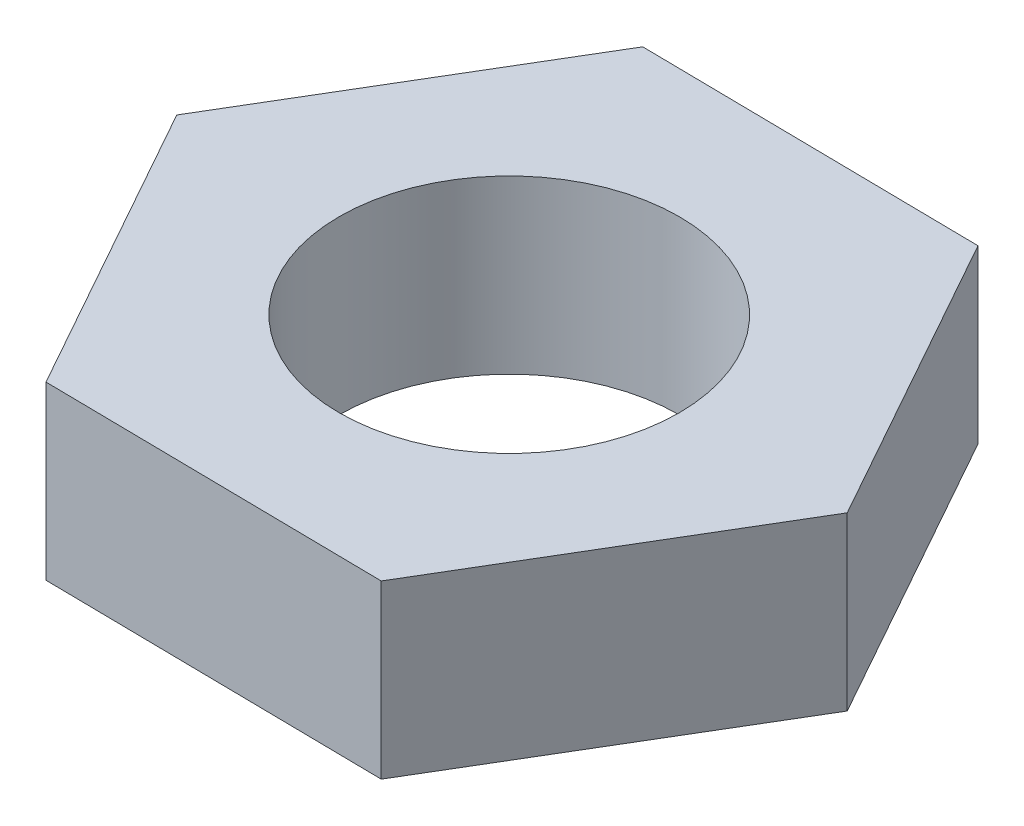
ISO-10303-21;
HEADER;
FILE_DESCRIPTION(('STEP AP214'),'2;1');
FILE_NAME('part.step','',(''),(''),'','','');
FILE_SCHEMA(('AUTOMOTIVE_DESIGN { 1 0 10303 214 1 1 1 1 }'));
ENDSEC;
DATA;
#1=APPLICATION_CONTEXT('core data for automotive mechanical design processes');
#2=APPLICATION_PROTOCOL_DEFINITION('international standard','automotive_design',2000,#1);
#3=PRODUCT_CONTEXT('',#1,'mechanical');
#4=PRODUCT('Part','Part','',(#3));
#5=PRODUCT_RELATED_PRODUCT_CATEGORY('part','',(#4));
#6=PRODUCT_DEFINITION_FORMATION('','',#4);
#7=PRODUCT_DEFINITION_CONTEXT('part definition',#1,'design');
#8=PRODUCT_DEFINITION('design','',#6,#7);
#9=PRODUCT_DEFINITION_SHAPE('','',#8);
#10=(LENGTH_UNIT() NAMED_UNIT(*) SI_UNIT(.MILLI.,.METRE.));
#11=(NAMED_UNIT(*) PLANE_ANGLE_UNIT() SI_UNIT($,.RADIAN.));
#12=(NAMED_UNIT(*) SI_UNIT($,.STERADIAN.) SOLID_ANGLE_UNIT());
#13=UNCERTAINTY_MEASURE_WITH_UNIT(LENGTH_MEASURE(1.E-05),#10,'distance_accuracy_value','');
#14=(GEOMETRIC_REPRESENTATION_CONTEXT(3) GLOBAL_UNCERTAINTY_ASSIGNED_CONTEXT((#13)) GLOBAL_UNIT_ASSIGNED_CONTEXT((#10,
#11,#12)) REPRESENTATION_CONTEXT('',''));
#15=CARTESIAN_POINT('',(0.,0.,0.));
#16=DIRECTION('',(0.,0.,1.));
#17=DIRECTION('',(1.,0.,0.));
#18=AXIS2_PLACEMENT_3D('',#15,#16,#17);
#19=CARTESIAN_POINT('',(2.49224465608922,2.56540000000005,-5.48045796995567));
#20=DIRECTION('',(0.859101543908761,0.,0.511805175094574));
#21=DIRECTION('',(0.511805175094574,0.,-0.859101543908761));
#22=AXIS2_PLACEMENT_3D('',#19,#20,#21);
#23=PLANE('',#22);
#24=DIRECTION('',(-0.511805175094574,0.,0.859101543908761));
#25=VECTOR('',#24,1.);
#26=CARTESIAN_POINT('',(2.49224465608922,0.,-5.48045796995567));
#27=LINE('',#26,#25);
#28=CARTESIAN_POINT('',(2.49224465608922,0.,-5.48045796995567));
#29=VERTEX_POINT('',#28);
#30=CARTESIAN_POINT('',(-0.107725633391009,0.,-1.11622212689921));
#31=VERTEX_POINT('',#30);
#32=EDGE_CURVE('E132',#29,#31,#27,.T.);
#33=ORIENTED_EDGE('',*,*,#32,.T.);
#34=DIRECTION('',(0.,-1.,0.));
#35=VECTOR('',#34,1.);
#36=CARTESIAN_POINT('',(-0.107725633391009,2.56540000000005,-1.11622212689921));
#37=LINE('',#36,#35);
#38=CARTESIAN_POINT('',(-0.107725633391009,2.56540000000005,-1.11622212689921));
#39=VERTEX_POINT('',#38);
#40=EDGE_CURVE('E11',#39,#31,#37,.T.);
#41=ORIENTED_EDGE('',*,*,#40,.F.);
#42=DIRECTION('',(-0.511805175094574,0.,0.859101543908761));
#43=VECTOR('',#42,1.);
#44=CARTESIAN_POINT('',(2.49224465608922,2.56540000000005,-5.48045796995567));
#45=LINE('',#44,#43);
#46=CARTESIAN_POINT('',(2.49224465608922,2.56540000000005,-5.48045796995567));
#47=VERTEX_POINT('',#46);
#48=EDGE_CURVE('E149',#47,#39,#45,.T.);
#49=ORIENTED_EDGE('',*,*,#48,.F.);
#50=DIRECTION('',(0.,-1.,0.));
#51=VECTOR('',#50,1.);
#52=CARTESIAN_POINT('',(2.49224465608922,2.56540000000005,-5.48045796995567));
#53=LINE('',#52,#51);
#54=EDGE_CURVE('E128',#47,#29,#53,.T.);
#55=ORIENTED_EDGE('',*,*,#54,.T.);
#56=EDGE_LOOP('',(#33,#41,#49,#55));
#57=FACE_BOUND('',#56,.T.);
#58=ADVANCED_FACE('F42',(#57),#23,.F.);
#59=CARTESIAN_POINT('',(-0.107725633391009,2.56540000000005,-1.11622212689921));
#60=DIRECTION('',(0.872787055374624,0.,-0.488101173908132));
#61=DIRECTION('',(-0.488101173908132,0.,-0.872787055374624));
#62=AXIS2_PLACEMENT_3D('',#59,#60,#61);
#63=PLANE('',#62);
#64=DIRECTION('',(0.488101173908132,0.,0.872787055374624));
#65=VECTOR('',#64,1.);
#66=CARTESIAN_POINT('',(-0.107725633391009,0.,-1.11622212689921));
#67=LINE('',#66,#65);
#68=CARTESIAN_POINT('',(2.37182833006211,0.,3.31753611440377));
#69=VERTEX_POINT('',#68);
#70=EDGE_CURVE('E136',#31,#69,#67,.T.);
#71=ORIENTED_EDGE('',*,*,#70,.T.);
#72=DIRECTION('',(0.,-1.,0.));
#73=VECTOR('',#72,1.);
#74=CARTESIAN_POINT('',(2.37182833006211,2.56540000000005,3.31753611440366));
#75=LINE('',#74,#73);
#76=CARTESIAN_POINT('',(2.37182833006211,2.56540000000005,3.31753611440366));
#77=VERTEX_POINT('',#76);
#78=EDGE_CURVE('E51',#77,#69,#75,.T.);
#79=ORIENTED_EDGE('',*,*,#78,.F.);
#80=DIRECTION('',(0.488101173908132,0.,0.872787055374624));
#81=VECTOR('',#80,1.);
#82=CARTESIAN_POINT('',(-0.107725633391009,2.56540000000005,-1.11622212689921));
#83=LINE('',#82,#81);
#84=EDGE_CURVE('E96',#39,#77,#83,.T.);
#85=ORIENTED_EDGE('',*,*,#84,.F.);
#86=ORIENTED_EDGE('',*,*,#40,.T.);
#87=EDGE_LOOP('',(#71,#79,#85,#86));
#88=FACE_BOUND('',#87,.T.);
#89=ADVANCED_FACE('F179',(#88),#63,.F.);
#90=CARTESIAN_POINT('',(2.37182833006211,2.56540000000005,3.31753611440366));
#91=DIRECTION('',(0.0136855114658628,0.,-0.999906349002706));
#92=DIRECTION('',(-0.999906349002706,0.,-0.0136855114658633));
#93=AXIS2_PLACEMENT_3D('',#90,#91,#92);
#94=PLANE('',#93);
#95=DIRECTION('',(0.999906349002706,0.,0.0136855114658633));
#96=VECTOR('',#95,1.);
#97=CARTESIAN_POINT('',(2.37182833006211,0.,3.31753611440377));
#98=LINE('',#97,#96);
#99=CARTESIAN_POINT('',(7.45135258299601,0.,3.38705851265053));
#100=VERTEX_POINT('',#99);
#101=EDGE_CURVE('E140',#69,#100,#98,.T.);
#102=ORIENTED_EDGE('',*,*,#101,.T.);
#103=DIRECTION('',(0.,-1.,0.));
#104=VECTOR('',#103,1.);
#105=CARTESIAN_POINT('',(7.4513525829959,2.56540000000005,3.38705851265031));
#106=LINE('',#105,#104);
#107=CARTESIAN_POINT('',(7.4513525829959,2.56540000000005,3.38705851265031));
#108=VERTEX_POINT('',#107);
#109=EDGE_CURVE('E120',#108,#100,#106,.T.);
#110=ORIENTED_EDGE('',*,*,#109,.F.);
#111=DIRECTION('',(0.999906349002706,0.,0.0136855114658633));
#112=VECTOR('',#111,1.);
#113=CARTESIAN_POINT('',(2.37182833006211,2.56540000000005,3.31753611440366));
#114=LINE('',#113,#112);
#115=EDGE_CURVE('E109',#77,#108,#114,.T.);
#116=ORIENTED_EDGE('',*,*,#115,.F.);
#117=ORIENTED_EDGE('',*,*,#78,.T.);
#118=EDGE_LOOP('',(#102,#110,#116,#117));
#119=FACE_BOUND('',#118,.T.);
#120=ADVANCED_FACE('F160',(#119),#94,.F.);
#121=CARTESIAN_POINT('',(7.4513525829959,2.56540000000005,3.38705851265031));
#122=DIRECTION('',(-0.859101543908761,0.,-0.511805175094574));
#123=DIRECTION('',(-0.511805175094573,0.,0.859101543908761));
#124=AXIS2_PLACEMENT_3D('',#121,#122,#123);
#125=PLANE('',#124);
#126=DIRECTION('',(0.511805175094573,0.,-0.859101543908761));
#127=VECTOR('',#126,1.);
#128=CARTESIAN_POINT('',(7.45135258299601,0.,3.38705851265053));
#129=LINE('',#128,#127);
#130=CARTESIAN_POINT('',(10.0513228724763,0.,-0.977177330406143));
#131=VERTEX_POINT('',#130);
#132=EDGE_CURVE('E118',#100,#131,#129,.T.);
#133=ORIENTED_EDGE('',*,*,#132,.T.);
#134=DIRECTION('',(0.,-1.,0.));
#135=VECTOR('',#134,1.);
#136=CARTESIAN_POINT('',(10.0513228724763,2.56540000000005,-0.977177330406143));
#137=LINE('',#136,#135);
#138=CARTESIAN_POINT('',(10.0513228724763,2.56540000000005,-0.977177330406143));
#139=VERTEX_POINT('',#138);
#140=EDGE_CURVE('E115',#139,#131,#137,.T.);
#141=ORIENTED_EDGE('',*,*,#140,.F.);
#142=DIRECTION('',(0.511805175094573,0.,-0.859101543908761));
#143=VECTOR('',#142,1.);
#144=CARTESIAN_POINT('',(7.4513525829959,2.56540000000005,3.38705851265031));
#145=LINE('',#144,#143);
#146=EDGE_CURVE('E103',#108,#139,#145,.T.);
#147=ORIENTED_EDGE('',*,*,#146,.F.);
#148=ORIENTED_EDGE('',*,*,#109,.T.);
#149=EDGE_LOOP('',(#133,#141,#147,#148));
#150=FACE_BOUND('',#149,.T.);
#151=ADVANCED_FACE('F116',(#150),#125,.F.);
#152=CARTESIAN_POINT('',(10.0513228724763,2.56540000000005,-0.977177330406143));
#153=DIRECTION('',(-0.872787055374624,0.,0.488101173908132));
#154=DIRECTION('',(0.488101173908132,0.,0.872787055374624));
#155=AXIS2_PLACEMENT_3D('',#152,#153,#154);
#156=PLANE('',#155);
#157=DIRECTION('',(-0.488101173908132,0.,-0.872787055374624));
#158=VECTOR('',#157,1.);
#159=CARTESIAN_POINT('',(10.0513228724763,0.,-0.977177330406143));
#160=LINE('',#159,#158);
#161=CARTESIAN_POINT('',(7.57176890902322,0.,-5.41093557170924));
#162=VERTEX_POINT('',#161);
#163=EDGE_CURVE('E82',#131,#162,#160,.T.);
#164=ORIENTED_EDGE('',*,*,#163,.T.);
#165=DIRECTION('',(0.,-1.,0.));
#166=VECTOR('',#165,1.);
#167=CARTESIAN_POINT('',(7.57176890902322,2.56540000000005,-5.41093557170935));
#168=LINE('',#167,#166);
#169=CARTESIAN_POINT('',(7.57176890902322,2.56540000000005,-5.41093557170935));
#170=VERTEX_POINT('',#169);
#171=EDGE_CURVE('E121',#170,#162,#168,.T.);
#172=ORIENTED_EDGE('',*,*,#171,.F.);
#173=DIRECTION('',(-0.488101173908132,0.,-0.872787055374624));
#174=VECTOR('',#173,1.);
#175=CARTESIAN_POINT('',(10.0513228724763,2.56540000000005,-0.977177330406143));
#176=LINE('',#175,#174);
#177=EDGE_CURVE('E107',#139,#170,#176,.T.);
#178=ORIENTED_EDGE('',*,*,#177,.F.);
#179=ORIENTED_EDGE('',*,*,#140,.T.);
#180=EDGE_LOOP('',(#164,#172,#178,#179));
#181=FACE_BOUND('',#180,.T.);
#182=ADVANCED_FACE('F123',(#181),#156,.F.);
#183=CARTESIAN_POINT('',(7.57176890902322,2.56540000000005,-5.41093557170935));
#184=DIRECTION('',(-0.0136855114658632,0.,0.999906349002707));
#185=DIRECTION('',(0.999906349002706,0.,0.0136855114658633));
#186=AXIS2_PLACEMENT_3D('',#183,#184,#185);
#187=PLANE('',#186);
#188=DIRECTION('',(-0.999906349002706,0.,-0.0136855114658636));
#189=VECTOR('',#188,1.);
#190=CARTESIAN_POINT('',(7.57176890902322,0.,-5.41093557170924));
#191=LINE('',#190,#189);
#192=EDGE_CURVE('E88',#162,#29,#191,.T.);
#193=ORIENTED_EDGE('',*,*,#192,.T.);
#194=ORIENTED_EDGE('',*,*,#54,.F.);
#195=DIRECTION('',(-0.999906349002706,0.,-0.0136855114658636));
#196=VECTOR('',#195,1.);
#197=CARTESIAN_POINT('',(7.57176890902322,2.56540000000005,-5.41093557170935));
#198=LINE('',#197,#196);
#199=EDGE_CURVE('E59',#170,#47,#198,.T.);
#200=ORIENTED_EDGE('',*,*,#199,.F.);
#201=ORIENTED_EDGE('',*,*,#171,.T.);
#202=EDGE_LOOP('',(#193,#194,#200,#201));
#203=FACE_BOUND('',#202,.T.);
#204=ADVANCED_FACE('F167',(#203),#187,.F.);
#205=CARTESIAN_POINT('',(1.11022302462516E-13,2.56540000000008,0.));
#206=DIRECTION('',(0.,1.,0.));
#207=DIRECTION('',(0.,0.,1.));
#208=AXIS2_PLACEMENT_3D('',#205,#206,#207);
#209=PLANE('',#208);
#210=CARTESIAN_POINT('',(4.9615682217059,2.56540000000008,-1.01541139697492));
#211=DIRECTION('',(0.,1.,0.));
#212=DIRECTION('',(0.,0.,1.));
#213=AXIS2_PLACEMENT_3D('',#210,#211,#212);
#214=CIRCLE('',#213,2.54000000000001);
#215=CARTESIAN_POINT('',(4.9615682217059,2.56540000000008,1.5245886030251));
#216=VERTEX_POINT('',#215);
#217=EDGE_CURVE('E234',#216,#216,#214,.T.);
#218=ORIENTED_EDGE('',*,*,#217,.F.);
#219=EDGE_LOOP('',(#218));
#220=FACE_BOUND('',#219,.T.);
#221=ORIENTED_EDGE('',*,*,#48,.T.);
#222=ORIENTED_EDGE('',*,*,#84,.T.);
#223=ORIENTED_EDGE('',*,*,#115,.T.);
#224=ORIENTED_EDGE('',*,*,#146,.T.);
#225=ORIENTED_EDGE('',*,*,#177,.T.);
#226=ORIENTED_EDGE('',*,*,#199,.T.);
#227=EDGE_LOOP('',(#221,#222,#223,#224,#225,#226));
#228=FACE_BOUND('',#227,.T.);
#229=ADVANCED_FACE('F105',(#220,#228),#209,.T.);
#230=CARTESIAN_POINT('',(0.,0.,0.));
#231=DIRECTION('',(0.,1.,0.));
#232=DIRECTION('',(0.,0.,1.));
#233=AXIS2_PLACEMENT_3D('',#230,#231,#232);
#234=PLANE('',#233);
#235=CARTESIAN_POINT('',(4.96156822170568,0.,-1.01541139697503));
#236=DIRECTION('',(0.,1.,0.));
#237=DIRECTION('',(0.,0.,1.));
#238=AXIS2_PLACEMENT_3D('',#235,#236,#237);
#239=CIRCLE('',#238,2.54000000000001);
#240=CARTESIAN_POINT('',(4.96156822170568,0.,1.52458860302499));
#241=VERTEX_POINT('',#240);
#242=EDGE_CURVE('E137',#241,#241,#239,.T.);
#243=ORIENTED_EDGE('',*,*,#242,.T.);
#244=EDGE_LOOP('',(#243));
#245=FACE_BOUND('',#244,.T.);
#246=ORIENTED_EDGE('',*,*,#32,.F.);
#247=ORIENTED_EDGE('',*,*,#192,.F.);
#248=ORIENTED_EDGE('',*,*,#163,.F.);
#249=ORIENTED_EDGE('',*,*,#132,.F.);
#250=ORIENTED_EDGE('',*,*,#101,.F.);
#251=ORIENTED_EDGE('',*,*,#70,.F.);
#252=EDGE_LOOP('',(#246,#247,#248,#249,#250,#251));
#253=FACE_BOUND('',#252,.T.);
#254=ADVANCED_FACE('F163',(#245,#253),#234,.F.);
#255=CARTESIAN_POINT('',(4.96156822170568,0.,-1.01541139697503));
#256=DIRECTION('',(0.,1.,0.));
#257=DIRECTION('',(0.,0.,1.));
#258=AXIS2_PLACEMENT_3D('',#255,#256,#257);
#259=CYLINDRICAL_SURFACE('',#258,2.54000000000001);
#260=ORIENTED_EDGE('',*,*,#242,.F.);
#261=EDGE_LOOP('',(#260));
#262=FACE_BOUND('',#261,.T.);
#263=ORIENTED_EDGE('',*,*,#217,.T.);
#264=EDGE_LOOP('',(#263));
#265=FACE_BOUND('',#264,.T.);
#266=ADVANCED_FACE('F216',(#262,#265),#259,.F.);
#267=CLOSED_SHELL('',(#58,#89,#120,#151,#182,#204,#229,#254,#266));
#268=MANIFOLD_SOLID_BREP('B2',#267);
#269=ADVANCED_BREP_SHAPE_REPRESENTATION('',(#18,#268),#14);
#270=SHAPE_DEFINITION_REPRESENTATION(#9,#269);
ENDSEC;
END-ISO-10303-21;
